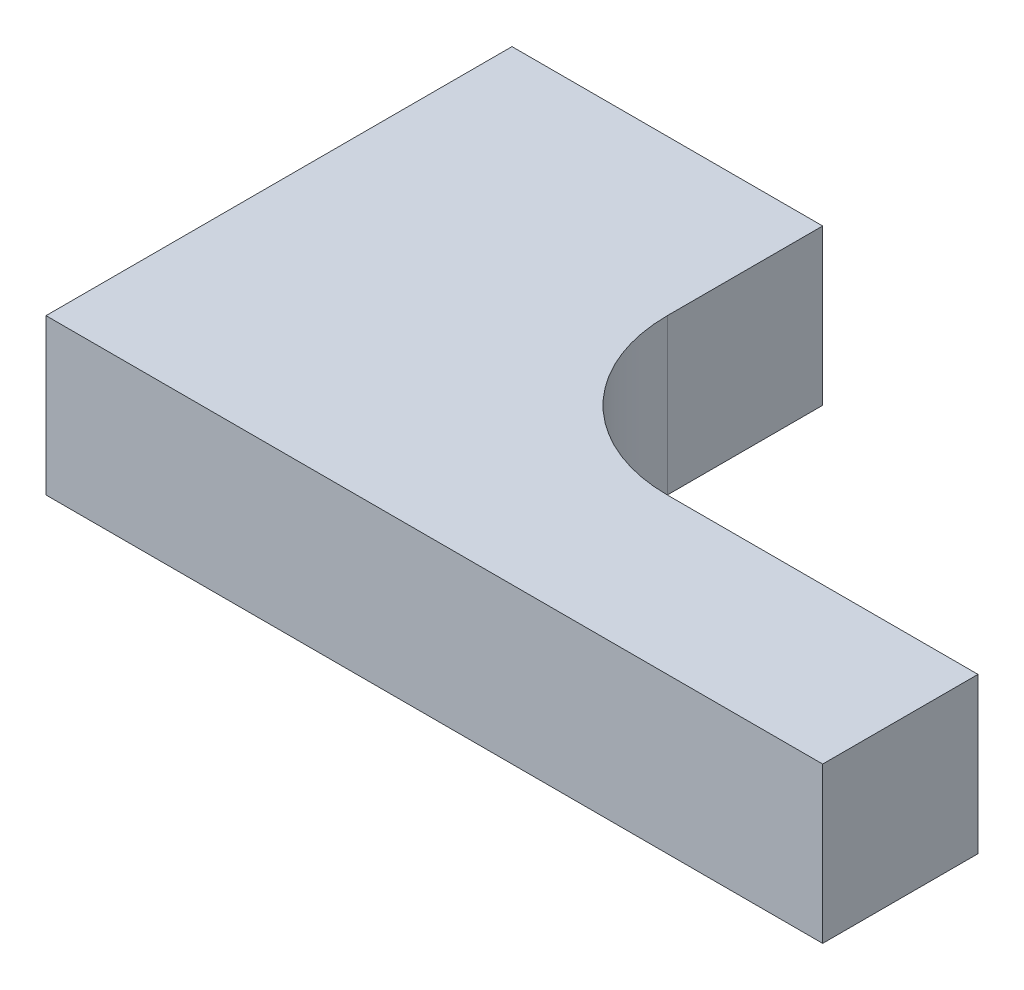
ISO-10303-21;
HEADER;
FILE_DESCRIPTION(('STEP AP214'),'2;1');
FILE_NAME('part.step','',(''),(''),'','','');
FILE_SCHEMA(('AUTOMOTIVE_DESIGN { 1 0 10303 214 1 1 1 1 }'));
ENDSEC;
DATA;
#1=APPLICATION_CONTEXT('core data for automotive mechanical design processes');
#2=APPLICATION_PROTOCOL_DEFINITION('international standard','automotive_design',2000,#1);
#3=PRODUCT_CONTEXT('',#1,'mechanical');
#4=PRODUCT('Part','Part','',(#3));
#5=PRODUCT_RELATED_PRODUCT_CATEGORY('part','',(#4));
#6=PRODUCT_DEFINITION_FORMATION('','',#4);
#7=PRODUCT_DEFINITION_CONTEXT('part definition',#1,'design');
#8=PRODUCT_DEFINITION('design','',#6,#7);
#9=PRODUCT_DEFINITION_SHAPE('','',#8);
#10=(LENGTH_UNIT() NAMED_UNIT(*) SI_UNIT(.MILLI.,.METRE.));
#11=(NAMED_UNIT(*) PLANE_ANGLE_UNIT() SI_UNIT($,.RADIAN.));
#12=(NAMED_UNIT(*) SI_UNIT($,.STERADIAN.) SOLID_ANGLE_UNIT());
#13=UNCERTAINTY_MEASURE_WITH_UNIT(LENGTH_MEASURE(1.E-05),#10,'distance_accuracy_value','');
#14=(GEOMETRIC_REPRESENTATION_CONTEXT(3) GLOBAL_UNCERTAINTY_ASSIGNED_CONTEXT((#13)) GLOBAL_UNIT_ASSIGNED_CONTEXT((#10,
#11,#12)) REPRESENTATION_CONTEXT('',''));
#15=CARTESIAN_POINT('',(0.,0.,0.));
#16=DIRECTION('',(0.,0.,1.));
#17=DIRECTION('',(1.,0.,0.));
#18=AXIS2_PLACEMENT_3D('',#15,#16,#17);
#19=CARTESIAN_POINT('',(-40.,20.,0.));
#20=DIRECTION('',(0.,0.,1.));
#21=DIRECTION('',(1.,0.,0.));
#22=AXIS2_PLACEMENT_3D('',#19,#20,#21);
#23=PLANE('',#22);
#24=DIRECTION('',(-1.,0.,0.));
#25=VECTOR('',#24,1.);
#26=CARTESIAN_POINT('',(-40.,0.,0.));
#27=LINE('',#26,#25);
#28=CARTESIAN_POINT('',(0.,0.,0.));
#29=VERTEX_POINT('',#28);
#30=CARTESIAN_POINT('',(-40.,0.,0.));
#31=VERTEX_POINT('',#30);
#32=EDGE_CURVE('E127',#29,#31,#27,.T.);
#33=ORIENTED_EDGE('',*,*,#32,.T.);
#34=DIRECTION('',(0.,-1.,0.));
#35=VECTOR('',#34,1.);
#36=CARTESIAN_POINT('',(-40.,20.,0.));
#37=LINE('',#36,#35);
#38=CARTESIAN_POINT('',(-40.,20.,0.));
#39=VERTEX_POINT('',#38);
#40=EDGE_CURVE('E11',#39,#31,#37,.T.);
#41=ORIENTED_EDGE('',*,*,#40,.F.);
#42=DIRECTION('',(-1.,0.,0.));
#43=VECTOR('',#42,1.);
#44=CARTESIAN_POINT('',(-40.,20.,0.));
#45=LINE('',#44,#43);
#46=CARTESIAN_POINT('',(0.,20.,0.));
#47=VERTEX_POINT('',#46);
#48=EDGE_CURVE('E139',#47,#39,#45,.T.);
#49=ORIENTED_EDGE('',*,*,#48,.F.);
#50=DIRECTION('',(0.,-1.,0.));
#51=VECTOR('',#50,1.);
#52=CARTESIAN_POINT('',(0.,20.,0.));
#53=LINE('',#52,#51);
#54=EDGE_CURVE('E123',#47,#29,#53,.T.);
#55=ORIENTED_EDGE('',*,*,#54,.T.);
#56=EDGE_LOOP('',(#33,#41,#49,#55));
#57=FACE_BOUND('',#56,.T.);
#58=ADVANCED_FACE('F37',(#57),#23,.F.);
#59=CARTESIAN_POINT('',(-40.,20.,60.));
#60=DIRECTION('',(1.,0.,0.));
#61=DIRECTION('',(0.,0.,-1.));
#62=AXIS2_PLACEMENT_3D('',#59,#60,#61);
#63=PLANE('',#62);
#64=DIRECTION('',(0.,0.,1.));
#65=VECTOR('',#64,1.);
#66=CARTESIAN_POINT('',(-40.,0.,60.));
#67=LINE('',#66,#65);
#68=CARTESIAN_POINT('',(-40.,0.,60.));
#69=VERTEX_POINT('',#68);
#70=EDGE_CURVE('E130',#31,#69,#67,.T.);
#71=ORIENTED_EDGE('',*,*,#70,.T.);
#72=DIRECTION('',(0.,-1.,0.));
#73=VECTOR('',#72,1.);
#74=CARTESIAN_POINT('',(-40.,20.,60.));
#75=LINE('',#74,#73);
#76=CARTESIAN_POINT('',(-40.,20.,60.));
#77=VERTEX_POINT('',#76);
#78=EDGE_CURVE('E45',#77,#69,#75,.T.);
#79=ORIENTED_EDGE('',*,*,#78,.F.);
#80=DIRECTION('',(0.,0.,1.));
#81=VECTOR('',#80,1.);
#82=CARTESIAN_POINT('',(-40.,20.,60.));
#83=LINE('',#82,#81);
#84=EDGE_CURVE('E93',#39,#77,#83,.T.);
#85=ORIENTED_EDGE('',*,*,#84,.F.);
#86=ORIENTED_EDGE('',*,*,#40,.T.);
#87=EDGE_LOOP('',(#71,#79,#85,#86));
#88=FACE_BOUND('',#87,.T.);
#89=ADVANCED_FACE('F164',(#88),#63,.F.);
#90=CARTESIAN_POINT('',(60.,20.,60.));
#91=DIRECTION('',(0.,0.,-1.));
#92=DIRECTION('',(-1.,0.,0.));
#93=AXIS2_PLACEMENT_3D('',#90,#91,#92);
#94=PLANE('',#93);
#95=DIRECTION('',(1.,0.,0.));
#96=VECTOR('',#95,1.);
#97=CARTESIAN_POINT('',(60.,0.,60.));
#98=LINE('',#97,#96);
#99=CARTESIAN_POINT('',(60.,0.,60.));
#100=VERTEX_POINT('',#99);
#101=EDGE_CURVE('E132',#69,#100,#98,.T.);
#102=ORIENTED_EDGE('',*,*,#101,.T.);
#103=DIRECTION('',(0.,-1.,0.));
#104=VECTOR('',#103,1.);
#105=CARTESIAN_POINT('',(60.,20.,60.));
#106=LINE('',#105,#104);
#107=CARTESIAN_POINT('',(60.,20.,60.));
#108=VERTEX_POINT('',#107);
#109=EDGE_CURVE('E143',#108,#100,#106,.T.);
#110=ORIENTED_EDGE('',*,*,#109,.F.);
#111=DIRECTION('',(1.,0.,0.));
#112=VECTOR('',#111,1.);
#113=CARTESIAN_POINT('',(60.,20.,60.));
#114=LINE('',#113,#112);
#115=EDGE_CURVE('E151',#77,#108,#114,.T.);
#116=ORIENTED_EDGE('',*,*,#115,.F.);
#117=ORIENTED_EDGE('',*,*,#78,.T.);
#118=EDGE_LOOP('',(#102,#110,#116,#117));
#119=FACE_BOUND('',#118,.T.);
#120=ADVANCED_FACE('F149',(#119),#94,.F.);
#121=CARTESIAN_POINT('',(60.,20.,40.));
#122=DIRECTION('',(-1.,0.,0.));
#123=DIRECTION('',(0.,0.,1.));
#124=AXIS2_PLACEMENT_3D('',#121,#122,#123);
#125=PLANE('',#124);
#126=DIRECTION('',(0.,0.,-1.));
#127=VECTOR('',#126,1.);
#128=CARTESIAN_POINT('',(60.,0.,40.));
#129=LINE('',#128,#127);
#130=CARTESIAN_POINT('',(60.,0.,40.));
#131=VERTEX_POINT('',#130);
#132=EDGE_CURVE('E134',#100,#131,#129,.T.);
#133=ORIENTED_EDGE('',*,*,#132,.T.);
#134=DIRECTION('',(0.,-1.,0.));
#135=VECTOR('',#134,1.);
#136=CARTESIAN_POINT('',(60.,20.,40.));
#137=LINE('',#136,#135);
#138=CARTESIAN_POINT('',(60.,20.,40.));
#139=VERTEX_POINT('',#138);
#140=EDGE_CURVE('E118',#139,#131,#137,.T.);
#141=ORIENTED_EDGE('',*,*,#140,.F.);
#142=DIRECTION('',(0.,0.,-1.));
#143=VECTOR('',#142,1.);
#144=CARTESIAN_POINT('',(60.,20.,40.));
#145=LINE('',#144,#143);
#146=EDGE_CURVE('E109',#108,#139,#145,.T.);
#147=ORIENTED_EDGE('',*,*,#146,.F.);
#148=ORIENTED_EDGE('',*,*,#109,.T.);
#149=EDGE_LOOP('',(#133,#141,#147,#148));
#150=FACE_BOUND('',#149,.T.);
#151=ADVANCED_FACE('F157',(#150),#125,.F.);
#152=CARTESIAN_POINT('',(20.,20.,40.));
#153=DIRECTION('',(0.,0.,1.));
#154=DIRECTION('',(1.,0.,0.));
#155=AXIS2_PLACEMENT_3D('',#152,#153,#154);
#156=PLANE('',#155);
#157=DIRECTION('',(-1.,0.,0.));
#158=VECTOR('',#157,1.);
#159=CARTESIAN_POINT('',(20.,0.,40.));
#160=LINE('',#159,#158);
#161=CARTESIAN_POINT('',(20.,0.,40.));
#162=VERTEX_POINT('',#161);
#163=EDGE_CURVE('E117',#131,#162,#160,.T.);
#164=ORIENTED_EDGE('',*,*,#163,.T.);
#165=DIRECTION('',(0.,-1.,0.));
#166=VECTOR('',#165,1.);
#167=CARTESIAN_POINT('',(20.,20.,40.));
#168=LINE('',#167,#166);
#169=CARTESIAN_POINT('',(20.,20.,40.));
#170=VERTEX_POINT('',#169);
#171=EDGE_CURVE('E114',#170,#162,#168,.T.);
#172=ORIENTED_EDGE('',*,*,#171,.F.);
#173=DIRECTION('',(-1.,0.,0.));
#174=VECTOR('',#173,1.);
#175=CARTESIAN_POINT('',(20.,20.,40.));
#176=LINE('',#175,#174);
#177=EDGE_CURVE('E103',#139,#170,#176,.T.);
#178=ORIENTED_EDGE('',*,*,#177,.F.);
#179=ORIENTED_EDGE('',*,*,#140,.T.);
#180=EDGE_LOOP('',(#164,#172,#178,#179));
#181=FACE_BOUND('',#180,.T.);
#182=ADVANCED_FACE('F115',(#181),#156,.F.);
#183=CARTESIAN_POINT('',(20.,20.,20.));
#184=DIRECTION('',(0.,-1.,0.));
#185=DIRECTION('',(0.,0.,-1.));
#186=AXIS2_PLACEMENT_3D('',#183,#184,#185);
#187=CYLINDRICAL_SURFACE('',#186,20.);
#188=CARTESIAN_POINT('',(20.,0.,20.));
#189=DIRECTION('',(0.,-1.,0.));
#190=DIRECTION('',(0.,0.,1.));
#191=AXIS2_PLACEMENT_3D('',#188,#189,#190);
#192=CIRCLE('',#191,20.);
#193=CARTESIAN_POINT('',(0.,0.,20.));
#194=VERTEX_POINT('',#193);
#195=EDGE_CURVE('E79',#162,#194,#192,.T.);
#196=ORIENTED_EDGE('',*,*,#195,.T.);
#197=DIRECTION('',(0.,-1.,0.));
#198=VECTOR('',#197,1.);
#199=CARTESIAN_POINT('',(0.,20.,20.));
#200=LINE('',#199,#198);
#201=CARTESIAN_POINT('',(0.,20.,20.));
#202=VERTEX_POINT('',#201);
#203=EDGE_CURVE('E119',#202,#194,#200,.T.);
#204=ORIENTED_EDGE('',*,*,#203,.F.);
#205=CARTESIAN_POINT('',(20.,20.,20.));
#206=DIRECTION('',(0.,-1.,0.));
#207=DIRECTION('',(0.,0.,1.));
#208=AXIS2_PLACEMENT_3D('',#205,#206,#207);
#209=CIRCLE('',#208,20.);
#210=EDGE_CURVE('E107',#170,#202,#209,.T.);
#211=ORIENTED_EDGE('',*,*,#210,.F.);
#212=ORIENTED_EDGE('',*,*,#171,.T.);
#213=EDGE_LOOP('',(#196,#204,#211,#212));
#214=FACE_BOUND('',#213,.T.);
#215=ADVANCED_FACE('F121',(#214),#187,.F.);
#216=CARTESIAN_POINT('',(0.,20.,0.));
#217=DIRECTION('',(-1.,0.,0.));
#218=DIRECTION('',(0.,0.,1.));
#219=AXIS2_PLACEMENT_3D('',#216,#217,#218);
#220=PLANE('',#219);
#221=DIRECTION('',(0.,0.,-1.));
#222=VECTOR('',#221,1.);
#223=CARTESIAN_POINT('',(0.,0.,0.));
#224=LINE('',#223,#222);
#225=EDGE_CURVE('E85',#194,#29,#224,.T.);
#226=ORIENTED_EDGE('',*,*,#225,.T.);
#227=ORIENTED_EDGE('',*,*,#54,.F.);
#228=DIRECTION('',(0.,0.,-1.));
#229=VECTOR('',#228,1.);
#230=CARTESIAN_POINT('',(0.,20.,0.));
#231=LINE('',#230,#229);
#232=EDGE_CURVE('E53',#202,#47,#231,.T.);
#233=ORIENTED_EDGE('',*,*,#232,.F.);
#234=ORIENTED_EDGE('',*,*,#203,.T.);
#235=EDGE_LOOP('',(#226,#227,#233,#234));
#236=FACE_BOUND('',#235,.T.);
#237=ADVANCED_FACE('F178',(#236),#220,.F.);
#238=CARTESIAN_POINT('',(20.,20.,20.));
#239=DIRECTION('',(0.,1.,0.));
#240=DIRECTION('',(0.,0.,1.));
#241=AXIS2_PLACEMENT_3D('',#238,#239,#240);
#242=PLANE('',#241);
#243=ORIENTED_EDGE('',*,*,#48,.T.);
#244=ORIENTED_EDGE('',*,*,#84,.T.);
#245=ORIENTED_EDGE('',*,*,#115,.T.);
#246=ORIENTED_EDGE('',*,*,#146,.T.);
#247=ORIENTED_EDGE('',*,*,#177,.T.);
#248=ORIENTED_EDGE('',*,*,#210,.T.);
#249=ORIENTED_EDGE('',*,*,#232,.T.);
#250=EDGE_LOOP('',(#243,#244,#245,#246,#247,#248,#249));
#251=FACE_BOUND('',#250,.T.);
#252=ADVANCED_FACE('F105',(#251),#242,.T.);
#253=CARTESIAN_POINT('',(20.,0.,20.));
#254=DIRECTION('',(0.,1.,0.));
#255=DIRECTION('',(0.,0.,1.));
#256=AXIS2_PLACEMENT_3D('',#253,#254,#255);
#257=PLANE('',#256);
#258=ORIENTED_EDGE('',*,*,#32,.F.);
#259=ORIENTED_EDGE('',*,*,#225,.F.);
#260=ORIENTED_EDGE('',*,*,#195,.F.);
#261=ORIENTED_EDGE('',*,*,#163,.F.);
#262=ORIENTED_EDGE('',*,*,#132,.F.);
#263=ORIENTED_EDGE('',*,*,#101,.F.);
#264=ORIENTED_EDGE('',*,*,#70,.F.);
#265=EDGE_LOOP('',(#258,#259,#260,#261,#262,#263,#264));
#266=FACE_BOUND('',#265,.T.);
#267=ADVANCED_FACE('F155',(#266),#257,.F.);
#268=CLOSED_SHELL('',(#58,#89,#120,#151,#182,#215,#237,#252,#267));
#269=MANIFOLD_SOLID_BREP('B2',#268);
#270=ADVANCED_BREP_SHAPE_REPRESENTATION('',(#18,#269),#14);
#271=SHAPE_DEFINITION_REPRESENTATION(#9,#270);
ENDSEC;
END-ISO-10303-21;
